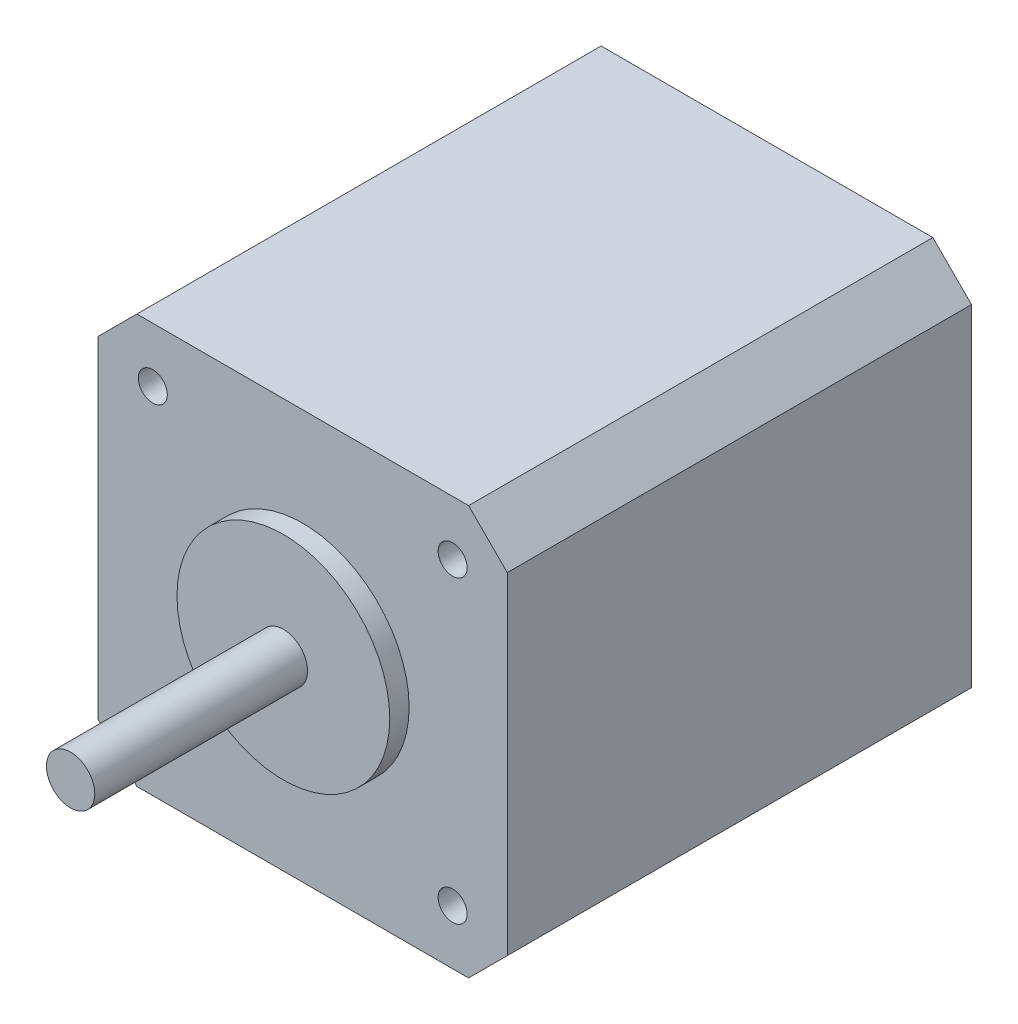
ISO-10303-21;
HEADER;
FILE_DESCRIPTION(('STEP AP214'),'2;1');
FILE_NAME('part.step','',(''),(''),'','','');
FILE_SCHEMA(('AUTOMOTIVE_DESIGN { 1 0 10303 214 1 1 1 1 }'));
ENDSEC;
DATA;
#1=APPLICATION_CONTEXT('core data for automotive mechanical design processes');
#2=APPLICATION_PROTOCOL_DEFINITION('international standard','automotive_design',2000,#1);
#3=PRODUCT_CONTEXT('',#1,'mechanical');
#4=PRODUCT('Part','Part','',(#3));
#5=PRODUCT_RELATED_PRODUCT_CATEGORY('part','',(#4));
#6=PRODUCT_DEFINITION_FORMATION('','',#4);
#7=PRODUCT_DEFINITION_CONTEXT('part definition',#1,'design');
#8=PRODUCT_DEFINITION('design','',#6,#7);
#9=PRODUCT_DEFINITION_SHAPE('','',#8);
#10=(LENGTH_UNIT() NAMED_UNIT(*) SI_UNIT(.MILLI.,.METRE.));
#11=(NAMED_UNIT(*) PLANE_ANGLE_UNIT() SI_UNIT($,.RADIAN.));
#12=(NAMED_UNIT(*) SI_UNIT($,.STERADIAN.) SOLID_ANGLE_UNIT());
#13=UNCERTAINTY_MEASURE_WITH_UNIT(LENGTH_MEASURE(1.E-05),#10,'distance_accuracy_value','');
#14=(GEOMETRIC_REPRESENTATION_CONTEXT(3) GLOBAL_UNCERTAINTY_ASSIGNED_CONTEXT((#13)) GLOBAL_UNIT_ASSIGNED_CONTEXT((#10,
#11,#12)) REPRESENTATION_CONTEXT('',''));
#15=CARTESIAN_POINT('',(0.,0.,0.));
#16=DIRECTION('',(0.,0.,1.));
#17=DIRECTION('',(1.,0.,0.));
#18=AXIS2_PLACEMENT_3D('',#15,#16,#17);
#19=CARTESIAN_POINT('',(21.15,21.15,-48.));
#20=DIRECTION('',(1.,0.,0.));
#21=DIRECTION('',(0.,0.,-1.));
#22=AXIS2_PLACEMENT_3D('',#19,#20,#21);
#23=PLANE('',#22);
#24=DIRECTION('',(0.,1.,0.));
#25=VECTOR('',#24,1.);
#26=CARTESIAN_POINT('',(21.15,21.15,0.));
#27=LINE('',#26,#25);
#28=CARTESIAN_POINT('',(21.15,-17.15,0.));
#29=VERTEX_POINT('',#28);
#30=CARTESIAN_POINT('',(21.15,17.15,0.));
#31=VERTEX_POINT('',#30);
#32=EDGE_CURVE('E170',#29,#31,#27,.T.);
#33=ORIENTED_EDGE('',*,*,#32,.F.);
#34=DIRECTION('',(0.,0.,-1.));
#35=VECTOR('',#34,1.);
#36=CARTESIAN_POINT('',(21.15,-17.15,-48.));
#37=LINE('',#36,#35);
#38=CARTESIAN_POINT('',(21.15,-17.15,-48.));
#39=VERTEX_POINT('',#38);
#40=EDGE_CURVE('E159',#29,#39,#37,.T.);
#41=ORIENTED_EDGE('',*,*,#40,.T.);
#42=DIRECTION('',(0.,1.,0.));
#43=VECTOR('',#42,1.);
#44=CARTESIAN_POINT('',(21.15,21.15,-48.));
#45=LINE('',#44,#43);
#46=CARTESIAN_POINT('',(21.15,17.15,-48.));
#47=VERTEX_POINT('',#46);
#48=EDGE_CURVE('E163',#39,#47,#45,.T.);
#49=ORIENTED_EDGE('',*,*,#48,.T.);
#50=DIRECTION('',(0.,0.,1.));
#51=VECTOR('',#50,1.);
#52=CARTESIAN_POINT('',(21.15,17.15,-48.));
#53=LINE('',#52,#51);
#54=EDGE_CURVE('E156',#47,#31,#53,.T.);
#55=ORIENTED_EDGE('',*,*,#54,.T.);
#56=EDGE_LOOP('',(#33,#41,#49,#55));
#57=FACE_BOUND('',#56,.T.);
#58=ADVANCED_FACE('F46',(#57),#23,.T.);
#59=CARTESIAN_POINT('',(-21.15,-21.15,-48.));
#60=DIRECTION('',(0.,-1.,0.));
#61=DIRECTION('',(0.,0.,-1.));
#62=AXIS2_PLACEMENT_3D('',#59,#60,#61);
#63=PLANE('',#62);
#64=DIRECTION('',(1.,0.,0.));
#65=VECTOR('',#64,1.);
#66=CARTESIAN_POINT('',(-21.15,-21.15,0.));
#67=LINE('',#66,#65);
#68=CARTESIAN_POINT('',(-17.15,-21.15,0.));
#69=VERTEX_POINT('',#68);
#70=CARTESIAN_POINT('',(17.15,-21.15,0.));
#71=VERTEX_POINT('',#70);
#72=EDGE_CURVE('E129',#69,#71,#67,.T.);
#73=ORIENTED_EDGE('',*,*,#72,.F.);
#74=DIRECTION('',(0.,0.,-1.));
#75=VECTOR('',#74,1.);
#76=CARTESIAN_POINT('',(-17.15,-21.15,-48.));
#77=LINE('',#76,#75);
#78=CARTESIAN_POINT('',(-17.15,-21.15,-48.));
#79=VERTEX_POINT('',#78);
#80=EDGE_CURVE('E147',#69,#79,#77,.T.);
#81=ORIENTED_EDGE('',*,*,#80,.T.);
#82=DIRECTION('',(1.,0.,0.));
#83=VECTOR('',#82,1.);
#84=CARTESIAN_POINT('',(-21.15,-21.15,-48.));
#85=LINE('',#84,#83);
#86=CARTESIAN_POINT('',(17.15,-21.15,-48.));
#87=VERTEX_POINT('',#86);
#88=EDGE_CURVE('E131',#79,#87,#85,.T.);
#89=ORIENTED_EDGE('',*,*,#88,.T.);
#90=DIRECTION('',(0.,0.,1.));
#91=VECTOR('',#90,1.);
#92=CARTESIAN_POINT('',(17.15,-21.15,-48.));
#93=LINE('',#92,#91);
#94=EDGE_CURVE('E144',#87,#71,#93,.T.);
#95=ORIENTED_EDGE('',*,*,#94,.T.);
#96=EDGE_LOOP('',(#73,#81,#89,#95));
#97=FACE_BOUND('',#96,.T.);
#98=ADVANCED_FACE('F253',(#97),#63,.T.);
#99=CARTESIAN_POINT('',(-21.15,21.15,-48.));
#100=DIRECTION('',(-1.,0.,0.));
#101=DIRECTION('',(0.,-1.,0.));
#102=AXIS2_PLACEMENT_3D('',#99,#100,#101);
#103=PLANE('',#102);
#104=DIRECTION('',(0.,-1.,0.));
#105=VECTOR('',#104,1.);
#106=CARTESIAN_POINT('',(-21.15,21.15,-48.));
#107=LINE('',#106,#105);
#108=CARTESIAN_POINT('',(-21.15,17.15,-48.));
#109=VERTEX_POINT('',#108);
#110=CARTESIAN_POINT('',(-21.15,-17.15,-48.));
#111=VERTEX_POINT('',#110);
#112=EDGE_CURVE('E135',#109,#111,#107,.T.);
#113=ORIENTED_EDGE('',*,*,#112,.T.);
#114=DIRECTION('',(0.,0.,1.));
#115=VECTOR('',#114,1.);
#116=CARTESIAN_POINT('',(-21.15,-17.15,-48.));
#117=LINE('',#116,#115);
#118=CARTESIAN_POINT('',(-21.15,-17.15,0.));
#119=VERTEX_POINT('',#118);
#120=EDGE_CURVE('E121',#111,#119,#117,.T.);
#121=ORIENTED_EDGE('',*,*,#120,.T.);
#122=DIRECTION('',(0.,-1.,0.));
#123=VECTOR('',#122,1.);
#124=CARTESIAN_POINT('',(-21.15,21.15,0.));
#125=LINE('',#124,#123);
#126=CARTESIAN_POINT('',(-21.15,17.15,0.));
#127=VERTEX_POINT('',#126);
#128=EDGE_CURVE('E114',#127,#119,#125,.T.);
#129=ORIENTED_EDGE('',*,*,#128,.F.);
#130=DIRECTION('',(0.,0.,-1.));
#131=VECTOR('',#130,1.);
#132=CARTESIAN_POINT('',(-21.15,17.15,-48.));
#133=LINE('',#132,#131);
#134=EDGE_CURVE('E127',#127,#109,#133,.T.);
#135=ORIENTED_EDGE('',*,*,#134,.T.);
#136=EDGE_LOOP('',(#113,#121,#129,#135));
#137=FACE_BOUND('',#136,.T.);
#138=ADVANCED_FACE('F126',(#137),#103,.T.);
#139=CARTESIAN_POINT('',(-21.15,21.15,-48.));
#140=DIRECTION('',(0.,1.,0.));
#141=DIRECTION('',(0.,0.,1.));
#142=AXIS2_PLACEMENT_3D('',#139,#140,#141);
#143=PLANE('',#142);
#144=DIRECTION('',(-1.,0.,0.));
#145=VECTOR('',#144,1.);
#146=CARTESIAN_POINT('',(-21.15,21.15,0.));
#147=LINE('',#146,#145);
#148=CARTESIAN_POINT('',(17.15,21.15,0.));
#149=VERTEX_POINT('',#148);
#150=CARTESIAN_POINT('',(-17.15,21.15,0.));
#151=VERTEX_POINT('',#150);
#152=EDGE_CURVE('E115',#149,#151,#147,.T.);
#153=ORIENTED_EDGE('',*,*,#152,.F.);
#154=DIRECTION('',(0.,0.,-1.));
#155=VECTOR('',#154,1.);
#156=CARTESIAN_POINT('',(17.15,21.15,-48.));
#157=LINE('',#156,#155);
#158=CARTESIAN_POINT('',(17.15,21.15,-48.));
#159=VERTEX_POINT('',#158);
#160=EDGE_CURVE('E14',#149,#159,#157,.T.);
#161=ORIENTED_EDGE('',*,*,#160,.T.);
#162=DIRECTION('',(-1.,0.,0.));
#163=VECTOR('',#162,1.);
#164=CARTESIAN_POINT('',(-21.15,21.15,-48.));
#165=LINE('',#164,#163);
#166=CARTESIAN_POINT('',(-17.15,21.15,-48.));
#167=VERTEX_POINT('',#166);
#168=EDGE_CURVE('E161',#159,#167,#165,.T.);
#169=ORIENTED_EDGE('',*,*,#168,.T.);
#170=DIRECTION('',(0.,0.,1.));
#171=VECTOR('',#170,1.);
#172=CARTESIAN_POINT('',(-17.15,21.15,-48.));
#173=LINE('',#172,#171);
#174=EDGE_CURVE('E54',#167,#151,#173,.T.);
#175=ORIENTED_EDGE('',*,*,#174,.T.);
#176=EDGE_LOOP('',(#153,#161,#169,#175));
#177=FACE_BOUND('',#176,.T.);
#178=ADVANCED_FACE('F160',(#177),#143,.T.);
#179=CARTESIAN_POINT('',(0.,0.,-48.));
#180=DIRECTION('',(0.,0.,1.));
#181=DIRECTION('',(1.,0.,0.));
#182=AXIS2_PLACEMENT_3D('',#179,#180,#181);
#183=PLANE('',#182);
#184=ORIENTED_EDGE('',*,*,#88,.F.);
#185=DIRECTION('',(0.707106781186549,-0.707106781186546,0.));
#186=VECTOR('',#185,1.);
#187=CARTESIAN_POINT('',(-21.15,-17.15,-48.));
#188=LINE('',#187,#186);
#189=EDGE_CURVE('E154',#79,#111,#188,.F.);
#190=ORIENTED_EDGE('',*,*,#189,.T.);
#191=ORIENTED_EDGE('',*,*,#112,.F.);
#192=DIRECTION('',(-0.707106781186546,-0.707106781186549,0.));
#193=VECTOR('',#192,1.);
#194=CARTESIAN_POINT('',(-17.15,21.15,-48.));
#195=LINE('',#194,#193);
#196=EDGE_CURVE('E61',#109,#167,#195,.F.);
#197=ORIENTED_EDGE('',*,*,#196,.T.);
#198=ORIENTED_EDGE('',*,*,#168,.F.);
#199=DIRECTION('',(-0.707106781186548,0.707106781186548,0.));
#200=VECTOR('',#199,1.);
#201=CARTESIAN_POINT('',(21.15,17.15,-48.));
#202=LINE('',#201,#200);
#203=EDGE_CURVE('E150',#159,#47,#202,.F.);
#204=ORIENTED_EDGE('',*,*,#203,.T.);
#205=ORIENTED_EDGE('',*,*,#48,.F.);
#206=DIRECTION('',(0.707106781186546,0.707106781186549,0.));
#207=VECTOR('',#206,1.);
#208=CARTESIAN_POINT('',(17.15,-21.15,-48.));
#209=LINE('',#208,#207);
#210=EDGE_CURVE('E152',#39,#87,#209,.F.);
#211=ORIENTED_EDGE('',*,*,#210,.T.);
#212=EDGE_LOOP('',(#184,#190,#191,#197,#198,#204,#205,#211));
#213=FACE_BOUND('',#212,.T.);
#214=ADVANCED_FACE('F232',(#213),#183,.F.);
#215=CARTESIAN_POINT('',(0.,0.,0.));
#216=DIRECTION('',(0.,0.,1.));
#217=DIRECTION('',(1.,0.,0.));
#218=AXIS2_PLACEMENT_3D('',#215,#216,#217);
#219=PLANE('',#218);
#220=CARTESIAN_POINT('',(0.,0.,0.));
#221=DIRECTION('',(0.,0.,1.));
#222=DIRECTION('',(1.,0.,0.));
#223=AXIS2_PLACEMENT_3D('',#220,#221,#222);
#224=CIRCLE('',#223,11.);
#225=CARTESIAN_POINT('',(11.,0.,0.));
#226=VERTEX_POINT('',#225);
#227=EDGE_CURVE('E201',#226,#226,#224,.T.);
#228=ORIENTED_EDGE('',*,*,#227,.F.);
#229=EDGE_LOOP('',(#228));
#230=FACE_BOUND('',#229,.T.);
#231=CARTESIAN_POINT('',(15.5,15.5,0.));
#232=DIRECTION('',(0.,0.,1.));
#233=DIRECTION('',(1.,0.,0.));
#234=AXIS2_PLACEMENT_3D('',#231,#232,#233);
#235=CIRCLE('',#234,1.5);
#236=CARTESIAN_POINT('',(17.,15.5,0.));
#237=VERTEX_POINT('',#236);
#238=EDGE_CURVE('E196',#237,#237,#235,.T.);
#239=ORIENTED_EDGE('',*,*,#238,.F.);
#240=EDGE_LOOP('',(#239));
#241=FACE_BOUND('',#240,.T.);
#242=CARTESIAN_POINT('',(15.5,-15.5,0.));
#243=DIRECTION('',(0.,0.,1.));
#244=DIRECTION('',(1.,0.,0.));
#245=AXIS2_PLACEMENT_3D('',#242,#243,#244);
#246=CIRCLE('',#245,1.5);
#247=CARTESIAN_POINT('',(17.,-15.5,0.));
#248=VERTEX_POINT('',#247);
#249=EDGE_CURVE('E190',#248,#248,#246,.T.);
#250=ORIENTED_EDGE('',*,*,#249,.F.);
#251=EDGE_LOOP('',(#250));
#252=FACE_BOUND('',#251,.T.);
#253=CARTESIAN_POINT('',(-15.5,-15.5,0.));
#254=DIRECTION('',(0.,0.,1.));
#255=DIRECTION('',(1.,0.,0.));
#256=AXIS2_PLACEMENT_3D('',#253,#254,#255);
#257=CIRCLE('',#256,1.5);
#258=CARTESIAN_POINT('',(-14.,-15.5,0.));
#259=VERTEX_POINT('',#258);
#260=EDGE_CURVE('E183',#259,#259,#257,.T.);
#261=ORIENTED_EDGE('',*,*,#260,.F.);
#262=EDGE_LOOP('',(#261));
#263=FACE_BOUND('',#262,.T.);
#264=CARTESIAN_POINT('',(-15.5,15.5,0.));
#265=DIRECTION('',(0.,0.,1.));
#266=DIRECTION('',(1.,0.,0.));
#267=AXIS2_PLACEMENT_3D('',#264,#265,#266);
#268=CIRCLE('',#267,1.5);
#269=CARTESIAN_POINT('',(-14.,15.5,0.));
#270=VERTEX_POINT('',#269);
#271=EDGE_CURVE('E176',#270,#270,#268,.T.);
#272=ORIENTED_EDGE('',*,*,#271,.F.);
#273=EDGE_LOOP('',(#272));
#274=FACE_BOUND('',#273,.T.);
#275=ORIENTED_EDGE('',*,*,#128,.T.);
#276=DIRECTION('',(-0.707106781186549,0.707106781186546,0.));
#277=VECTOR('',#276,1.);
#278=CARTESIAN_POINT('',(-19.15,-19.15,0.));
#279=LINE('',#278,#277);
#280=EDGE_CURVE('E142',#119,#69,#279,.F.);
#281=ORIENTED_EDGE('',*,*,#280,.T.);
#282=ORIENTED_EDGE('',*,*,#72,.T.);
#283=DIRECTION('',(-0.707106781186546,-0.707106781186549,0.));
#284=VECTOR('',#283,1.);
#285=CARTESIAN_POINT('',(19.15,-19.1499999999999,0.));
#286=LINE('',#285,#284);
#287=EDGE_CURVE('E140',#71,#29,#286,.F.);
#288=ORIENTED_EDGE('',*,*,#287,.T.);
#289=ORIENTED_EDGE('',*,*,#32,.T.);
#290=DIRECTION('',(0.707106781186548,-0.707106781186548,0.));
#291=VECTOR('',#290,1.);
#292=CARTESIAN_POINT('',(19.15,19.15,0.));
#293=LINE('',#292,#291);
#294=EDGE_CURVE('E120',#31,#149,#293,.F.);
#295=ORIENTED_EDGE('',*,*,#294,.T.);
#296=ORIENTED_EDGE('',*,*,#152,.T.);
#297=DIRECTION('',(0.707106781186546,0.707106781186549,0.));
#298=VECTOR('',#297,1.);
#299=CARTESIAN_POINT('',(-19.15,19.15,0.));
#300=LINE('',#299,#298);
#301=EDGE_CURVE('E111',#151,#127,#300,.F.);
#302=ORIENTED_EDGE('',*,*,#301,.T.);
#303=EDGE_LOOP('',(#275,#281,#282,#288,#289,#295,#296,#302));
#304=FACE_BOUND('',#303,.T.);
#305=ADVANCED_FACE('F113',(#230,#241,#252,#263,#274,#304),#219,.T.);
#306=CARTESIAN_POINT('',(-15.5,15.5,-6.));
#307=DIRECTION('',(0.,0.,1.));
#308=DIRECTION('',(1.,0.,0.));
#309=AXIS2_PLACEMENT_3D('',#306,#307,#308);
#310=CYLINDRICAL_SURFACE('',#309,1.5);
#311=CARTESIAN_POINT('',(-15.5,15.5,-6.));
#312=DIRECTION('',(0.,0.,1.));
#313=DIRECTION('',(1.,0.,0.));
#314=AXIS2_PLACEMENT_3D('',#311,#312,#313);
#315=CIRCLE('',#314,1.5);
#316=CARTESIAN_POINT('',(-14.,15.5,-6.));
#317=VERTEX_POINT('',#316);
#318=EDGE_CURVE('E173',#317,#317,#315,.T.);
#319=ORIENTED_EDGE('',*,*,#318,.F.);
#320=EDGE_LOOP('',(#319));
#321=FACE_BOUND('',#320,.T.);
#322=ORIENTED_EDGE('',*,*,#271,.T.);
#323=EDGE_LOOP('',(#322));
#324=FACE_BOUND('',#323,.T.);
#325=ADVANCED_FACE('F231',(#321,#324),#310,.F.);
#326=CARTESIAN_POINT('',(-15.5,15.5,-6.));
#327=DIRECTION('',(0.,0.,1.));
#328=DIRECTION('',(1.,0.,0.));
#329=AXIS2_PLACEMENT_3D('',#326,#327,#328);
#330=PLANE('',#329);
#331=ORIENTED_EDGE('',*,*,#318,.T.);
#332=EDGE_LOOP('',(#331));
#333=FACE_BOUND('',#332,.T.);
#334=ADVANCED_FACE('F243',(#333),#330,.T.);
#335=CARTESIAN_POINT('',(-15.5,-15.5,-6.));
#336=DIRECTION('',(0.,0.,1.));
#337=DIRECTION('',(1.,0.,0.));
#338=AXIS2_PLACEMENT_3D('',#335,#336,#337);
#339=CYLINDRICAL_SURFACE('',#338,1.5);
#340=CARTESIAN_POINT('',(-15.5,-15.5,-6.));
#341=DIRECTION('',(0.,0.,1.));
#342=DIRECTION('',(1.,0.,0.));
#343=AXIS2_PLACEMENT_3D('',#340,#341,#342);
#344=CIRCLE('',#343,1.5);
#345=CARTESIAN_POINT('',(-14.,-15.5,-6.));
#346=VERTEX_POINT('',#345);
#347=EDGE_CURVE('E186',#346,#346,#344,.T.);
#348=ORIENTED_EDGE('',*,*,#347,.F.);
#349=EDGE_LOOP('',(#348));
#350=FACE_BOUND('',#349,.T.);
#351=ORIENTED_EDGE('',*,*,#260,.T.);
#352=EDGE_LOOP('',(#351));
#353=FACE_BOUND('',#352,.T.);
#354=ADVANCED_FACE('F249',(#350,#353),#339,.F.);
#355=CARTESIAN_POINT('',(-15.5,-15.5,-6.));
#356=DIRECTION('',(0.,0.,1.));
#357=DIRECTION('',(1.,0.,0.));
#358=AXIS2_PLACEMENT_3D('',#355,#356,#357);
#359=PLANE('',#358);
#360=ORIENTED_EDGE('',*,*,#347,.T.);
#361=EDGE_LOOP('',(#360));
#362=FACE_BOUND('',#361,.T.);
#363=ADVANCED_FACE('F387',(#362),#359,.T.);
#364=CARTESIAN_POINT('',(15.5,-15.5,-6.));
#365=DIRECTION('',(0.,0.,1.));
#366=DIRECTION('',(1.,0.,0.));
#367=AXIS2_PLACEMENT_3D('',#364,#365,#366);
#368=CYLINDRICAL_SURFACE('',#367,1.5);
#369=CARTESIAN_POINT('',(15.5,-15.5,-6.));
#370=DIRECTION('',(0.,0.,1.));
#371=DIRECTION('',(1.,0.,0.));
#372=AXIS2_PLACEMENT_3D('',#369,#370,#371);
#373=CIRCLE('',#372,1.5);
#374=CARTESIAN_POINT('',(17.,-15.5,-6.));
#375=VERTEX_POINT('',#374);
#376=EDGE_CURVE('E193',#375,#375,#373,.T.);
#377=ORIENTED_EDGE('',*,*,#376,.F.);
#378=EDGE_LOOP('',(#377));
#379=FACE_BOUND('',#378,.T.);
#380=ORIENTED_EDGE('',*,*,#249,.T.);
#381=EDGE_LOOP('',(#380));
#382=FACE_BOUND('',#381,.T.);
#383=ADVANCED_FACE('F379',(#379,#382),#368,.F.);
#384=CARTESIAN_POINT('',(15.5,-15.5,-6.));
#385=DIRECTION('',(0.,0.,1.));
#386=DIRECTION('',(1.,0.,0.));
#387=AXIS2_PLACEMENT_3D('',#384,#385,#386);
#388=PLANE('',#387);
#389=ORIENTED_EDGE('',*,*,#376,.T.);
#390=EDGE_LOOP('',(#389));
#391=FACE_BOUND('',#390,.T.);
#392=ADVANCED_FACE('F371',(#391),#388,.T.);
#393=CARTESIAN_POINT('',(15.5,15.5,-6.));
#394=DIRECTION('',(0.,0.,1.));
#395=DIRECTION('',(1.,0.,0.));
#396=AXIS2_PLACEMENT_3D('',#393,#394,#395);
#397=CYLINDRICAL_SURFACE('',#396,1.5);
#398=CARTESIAN_POINT('',(15.5,15.5,-6.));
#399=DIRECTION('',(0.,0.,1.));
#400=DIRECTION('',(1.,0.,0.));
#401=AXIS2_PLACEMENT_3D('',#398,#399,#400);
#402=CIRCLE('',#401,1.5);
#403=CARTESIAN_POINT('',(17.,15.5,-6.));
#404=VERTEX_POINT('',#403);
#405=EDGE_CURVE('E181',#404,#404,#402,.T.);
#406=ORIENTED_EDGE('',*,*,#405,.F.);
#407=EDGE_LOOP('',(#406));
#408=FACE_BOUND('',#407,.T.);
#409=ORIENTED_EDGE('',*,*,#238,.T.);
#410=EDGE_LOOP('',(#409));
#411=FACE_BOUND('',#410,.T.);
#412=ADVANCED_FACE('F363',(#408,#411),#397,.F.);
#413=CARTESIAN_POINT('',(15.5,15.5,-6.));
#414=DIRECTION('',(0.,0.,1.));
#415=DIRECTION('',(1.,0.,0.));
#416=AXIS2_PLACEMENT_3D('',#413,#414,#415);
#417=PLANE('',#416);
#418=ORIENTED_EDGE('',*,*,#405,.T.);
#419=EDGE_LOOP('',(#418));
#420=FACE_BOUND('',#419,.T.);
#421=ADVANCED_FACE('F225',(#420),#417,.T.);
#422=CARTESIAN_POINT('',(0.,0.,2.));
#423=DIRECTION('',(0.,0.,-1.));
#424=DIRECTION('',(-1.,0.,0.));
#425=AXIS2_PLACEMENT_3D('',#422,#423,#424);
#426=CYLINDRICAL_SURFACE('',#425,11.);
#427=CARTESIAN_POINT('',(0.,0.,2.));
#428=DIRECTION('',(0.,0.,1.));
#429=DIRECTION('',(1.,0.,0.));
#430=AXIS2_PLACEMENT_3D('',#427,#428,#429);
#431=CIRCLE('',#430,11.);
#432=CARTESIAN_POINT('',(11.,0.,2.));
#433=VERTEX_POINT('',#432);
#434=EDGE_CURVE('E187',#433,#433,#431,.T.);
#435=ORIENTED_EDGE('',*,*,#434,.F.);
#436=EDGE_LOOP('',(#435));
#437=FACE_BOUND('',#436,.T.);
#438=ORIENTED_EDGE('',*,*,#227,.T.);
#439=EDGE_LOOP('',(#438));
#440=FACE_BOUND('',#439,.T.);
#441=ADVANCED_FACE('F219',(#437,#440),#426,.T.);
#442=CARTESIAN_POINT('',(0.,0.,2.));
#443=DIRECTION('',(0.,0.,1.));
#444=DIRECTION('',(1.,0.,0.));
#445=AXIS2_PLACEMENT_3D('',#442,#443,#444);
#446=PLANE('',#445);
#447=CARTESIAN_POINT('',(0.,0.,2.));
#448=DIRECTION('',(0.,0.,1.));
#449=DIRECTION('',(1.,0.,0.));
#450=AXIS2_PLACEMENT_3D('',#447,#448,#449);
#451=CIRCLE('',#450,2.5);
#452=CARTESIAN_POINT('',(2.5,0.,2.));
#453=VERTEX_POINT('',#452);
#454=EDGE_CURVE('E209',#453,#453,#451,.T.);
#455=ORIENTED_EDGE('',*,*,#454,.F.);
#456=EDGE_LOOP('',(#455));
#457=FACE_BOUND('',#456,.T.);
#458=ORIENTED_EDGE('',*,*,#434,.T.);
#459=EDGE_LOOP('',(#458));
#460=FACE_BOUND('',#459,.T.);
#461=ADVANCED_FACE('F216',(#457,#460),#446,.T.);
#462=CARTESIAN_POINT('',(0.,0.,55.0710678118655));
#463=DIRECTION('',(0.,0.,-1.));
#464=DIRECTION('',(-1.,0.,0.));
#465=AXIS2_PLACEMENT_3D('',#462,#463,#464);
#466=CYLINDRICAL_SURFACE('',#465,2.5);
#467=ORIENTED_EDGE('',*,*,#454,.T.);
#468=EDGE_LOOP('',(#467));
#469=FACE_BOUND('',#468,.T.);
#470=CARTESIAN_POINT('',(0.,0.,24.));
#471=DIRECTION('',(0.,0.,1.));
#472=DIRECTION('',(1.,0.,0.));
#473=AXIS2_PLACEMENT_3D('',#470,#471,#472);
#474=CIRCLE('',#473,2.5);
#475=CARTESIAN_POINT('',(2.5,0.,24.));
#476=VERTEX_POINT('',#475);
#477=EDGE_CURVE('E204',#476,#476,#474,.T.);
#478=ORIENTED_EDGE('',*,*,#477,.F.);
#479=EDGE_LOOP('',(#478));
#480=FACE_BOUND('',#479,.T.);
#481=ADVANCED_FACE('F213',(#469,#480),#466,.T.);
#482=CARTESIAN_POINT('',(0.,0.,24.));
#483=DIRECTION('',(0.,0.,1.));
#484=DIRECTION('',(1.,0.,0.));
#485=AXIS2_PLACEMENT_3D('',#482,#483,#484);
#486=PLANE('',#485);
#487=ORIENTED_EDGE('',*,*,#477,.T.);
#488=EDGE_LOOP('',(#487));
#489=FACE_BOUND('',#488,.T.);
#490=ADVANCED_FACE('F268',(#489),#486,.T.);
#491=CARTESIAN_POINT('',(-21.15,-17.15,-48.));
#492=DIRECTION('',(0.707106781186546,0.707106781186549,0.));
#493=DIRECTION('',(0.,0.,1.));
#494=AXIS2_PLACEMENT_3D('',#491,#492,#493);
#495=PLANE('',#494);
#496=ORIENTED_EDGE('',*,*,#189,.F.);
#497=ORIENTED_EDGE('',*,*,#80,.F.);
#498=ORIENTED_EDGE('',*,*,#280,.F.);
#499=ORIENTED_EDGE('',*,*,#120,.F.);
#500=EDGE_LOOP('',(#496,#497,#498,#499));
#501=FACE_BOUND('',#500,.T.);
#502=ADVANCED_FACE('F264',(#501),#495,.F.);
#503=CARTESIAN_POINT('',(17.15,-21.15,-48.));
#504=DIRECTION('',(-0.707106781186549,0.707106781186546,0.));
#505=DIRECTION('',(0.,0.,1.));
#506=AXIS2_PLACEMENT_3D('',#503,#504,#505);
#507=PLANE('',#506);
#508=ORIENTED_EDGE('',*,*,#210,.F.);
#509=ORIENTED_EDGE('',*,*,#40,.F.);
#510=ORIENTED_EDGE('',*,*,#287,.F.);
#511=ORIENTED_EDGE('',*,*,#94,.F.);
#512=EDGE_LOOP('',(#508,#509,#510,#511));
#513=FACE_BOUND('',#512,.T.);
#514=ADVANCED_FACE('F267',(#513),#507,.F.);
#515=CARTESIAN_POINT('',(21.15,17.15,-48.));
#516=DIRECTION('',(-0.707106781186547,-0.707106781186547,0.));
#517=DIRECTION('',(0.,0.,1.));
#518=AXIS2_PLACEMENT_3D('',#515,#516,#517);
#519=PLANE('',#518);
#520=ORIENTED_EDGE('',*,*,#203,.F.);
#521=ORIENTED_EDGE('',*,*,#160,.F.);
#522=ORIENTED_EDGE('',*,*,#294,.F.);
#523=ORIENTED_EDGE('',*,*,#54,.F.);
#524=EDGE_LOOP('',(#520,#521,#522,#523));
#525=FACE_BOUND('',#524,.T.);
#526=ADVANCED_FACE('F271',(#525),#519,.F.);
#527=CARTESIAN_POINT('',(-17.15,21.15,-48.));
#528=DIRECTION('',(0.707106781186549,-0.707106781186546,0.));
#529=DIRECTION('',(0.,0.,1.));
#530=AXIS2_PLACEMENT_3D('',#527,#528,#529);
#531=PLANE('',#530);
#532=ORIENTED_EDGE('',*,*,#196,.F.);
#533=ORIENTED_EDGE('',*,*,#134,.F.);
#534=ORIENTED_EDGE('',*,*,#301,.F.);
#535=ORIENTED_EDGE('',*,*,#174,.F.);
#536=EDGE_LOOP('',(#532,#533,#534,#535));
#537=FACE_BOUND('',#536,.T.);
#538=ADVANCED_FACE('F48',(#537),#531,.F.);
#539=CLOSED_SHELL('',(#58,#98,#138,#178,#214,#305,#325,#334,#354,#363,#383,#392,#412,#421,#441,
#461,#481,#490,#502,#514,#526,#538));
#540=MANIFOLD_SOLID_BREP('B2',#539);
#541=ADVANCED_BREP_SHAPE_REPRESENTATION('',(#18,#540),#14);
#542=SHAPE_DEFINITION_REPRESENTATION(#9,#541);
ENDSEC;
END-ISO-10303-21;
